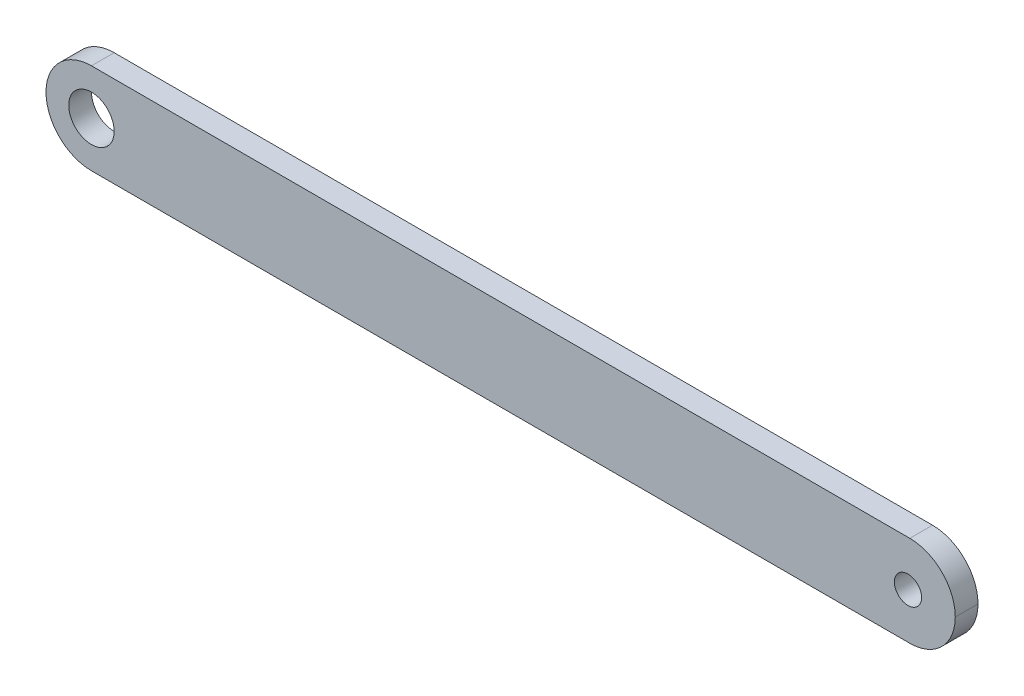
ISO-10303-21;
HEADER;
FILE_DESCRIPTION(('STEP AP214'),'2;1');
FILE_NAME('part.step','',(''),(''),'','','');
FILE_SCHEMA(('AUTOMOTIVE_DESIGN { 1 0 10303 214 1 1 1 1 }'));
ENDSEC;
DATA;
#1=APPLICATION_CONTEXT('core data for automotive mechanical design processes');
#2=APPLICATION_PROTOCOL_DEFINITION('international standard','automotive_design',2000,#1);
#3=PRODUCT_CONTEXT('',#1,'mechanical');
#4=PRODUCT('Part','Part','',(#3));
#5=PRODUCT_RELATED_PRODUCT_CATEGORY('part','',(#4));
#6=PRODUCT_DEFINITION_FORMATION('','',#4);
#7=PRODUCT_DEFINITION_CONTEXT('part definition',#1,'design');
#8=PRODUCT_DEFINITION('design','',#6,#7);
#9=PRODUCT_DEFINITION_SHAPE('','',#8);
#10=(LENGTH_UNIT() NAMED_UNIT(*) SI_UNIT(.MILLI.,.METRE.));
#11=(NAMED_UNIT(*) PLANE_ANGLE_UNIT() SI_UNIT($,.RADIAN.));
#12=(NAMED_UNIT(*) SI_UNIT($,.STERADIAN.) SOLID_ANGLE_UNIT());
#13=UNCERTAINTY_MEASURE_WITH_UNIT(LENGTH_MEASURE(1.E-05),#10,'distance_accuracy_value','');
#14=(GEOMETRIC_REPRESENTATION_CONTEXT(3) GLOBAL_UNCERTAINTY_ASSIGNED_CONTEXT((#13)) GLOBAL_UNIT_ASSIGNED_CONTEXT((#10,
#11,#12)) REPRESENTATION_CONTEXT('',''));
#15=CARTESIAN_POINT('',(0.,0.,0.));
#16=DIRECTION('',(0.,0.,1.));
#17=DIRECTION('',(1.,0.,0.));
#18=AXIS2_PLACEMENT_3D('',#15,#16,#17);
#19=CARTESIAN_POINT('',(0.,0.,3.175));
#20=DIRECTION('',(0.,1.,0.));
#21=DIRECTION('',(0.,0.,1.));
#22=AXIS2_PLACEMENT_3D('',#19,#20,#21);
#23=PLANE('',#22);
#24=DIRECTION('',(1.,0.,0.));
#25=VECTOR('',#24,1.);
#26=CARTESIAN_POINT('',(0.,0.,0.));
#27=LINE('',#26,#25);
#28=CARTESIAN_POINT('',(6.35,0.,0.));
#29=VERTEX_POINT('',#28);
#30=CARTESIAN_POINT('',(120.65,0.,0.));
#31=VERTEX_POINT('',#30);
#32=EDGE_CURVE('E99',#29,#31,#27,.T.);
#33=ORIENTED_EDGE('',*,*,#32,.T.);
#34=DIRECTION('',(0.,0.,-1.));
#35=VECTOR('',#34,1.);
#36=CARTESIAN_POINT('',(120.65,0.,3.175));
#37=LINE('',#36,#35);
#38=CARTESIAN_POINT('',(120.65,0.,3.175));
#39=VERTEX_POINT('',#38);
#40=EDGE_CURVE('E138',#31,#39,#37,.F.);
#41=ORIENTED_EDGE('',*,*,#40,.T.);
#42=DIRECTION('',(1.,0.,0.));
#43=VECTOR('',#42,1.);
#44=CARTESIAN_POINT('',(0.,0.,3.175));
#45=LINE('',#44,#43);
#46=CARTESIAN_POINT('',(6.35,0.,3.175));
#47=VERTEX_POINT('',#46);
#48=EDGE_CURVE('E148',#47,#39,#45,.T.);
#49=ORIENTED_EDGE('',*,*,#48,.F.);
#50=DIRECTION('',(0.,0.,-1.));
#51=VECTOR('',#50,1.);
#52=CARTESIAN_POINT('',(6.35,0.,3.175));
#53=LINE('',#52,#51);
#54=EDGE_CURVE('E129',#47,#29,#53,.T.);
#55=ORIENTED_EDGE('',*,*,#54,.T.);
#56=EDGE_LOOP('',(#33,#41,#49,#55));
#57=FACE_BOUND('',#56,.T.);
#58=ADVANCED_FACE('F39',(#57),#23,.F.);
#59=CARTESIAN_POINT('',(0.,12.7,3.175));
#60=DIRECTION('',(0.,-1.,0.));
#61=DIRECTION('',(0.,0.,-1.));
#62=AXIS2_PLACEMENT_3D('',#59,#60,#61);
#63=PLANE('',#62);
#64=DIRECTION('',(-1.,0.,0.));
#65=VECTOR('',#64,1.);
#66=CARTESIAN_POINT('',(0.,12.7,3.175));
#67=LINE('',#66,#65);
#68=CARTESIAN_POINT('',(120.65,12.7,3.175));
#69=VERTEX_POINT('',#68);
#70=CARTESIAN_POINT('',(6.35,12.7,3.175));
#71=VERTEX_POINT('',#70);
#72=EDGE_CURVE('E103',#69,#71,#67,.T.);
#73=ORIENTED_EDGE('',*,*,#72,.F.);
#74=DIRECTION('',(0.,0.,-1.));
#75=VECTOR('',#74,1.);
#76=CARTESIAN_POINT('',(120.65,12.7,3.175));
#77=LINE('',#76,#75);
#78=CARTESIAN_POINT('',(120.65,12.7,0.));
#79=VERTEX_POINT('',#78);
#80=EDGE_CURVE('E11',#69,#79,#77,.T.);
#81=ORIENTED_EDGE('',*,*,#80,.T.);
#82=DIRECTION('',(-1.,0.,0.));
#83=VECTOR('',#82,1.);
#84=CARTESIAN_POINT('',(0.,12.7,0.));
#85=LINE('',#84,#83);
#86=CARTESIAN_POINT('',(6.35,12.7,0.));
#87=VERTEX_POINT('',#86);
#88=EDGE_CURVE('E153',#79,#87,#85,.T.);
#89=ORIENTED_EDGE('',*,*,#88,.T.);
#90=DIRECTION('',(0.,0.,-1.));
#91=VECTOR('',#90,1.);
#92=CARTESIAN_POINT('',(6.35,12.7,3.175));
#93=LINE('',#92,#91);
#94=EDGE_CURVE('E117',#87,#71,#93,.F.);
#95=ORIENTED_EDGE('',*,*,#94,.T.);
#96=EDGE_LOOP('',(#73,#81,#89,#95));
#97=FACE_BOUND('',#96,.T.);
#98=ADVANCED_FACE('F183',(#97),#63,.F.);
#99=CARTESIAN_POINT('',(0.,0.,3.175));
#100=DIRECTION('',(0.,0.,-1.));
#101=DIRECTION('',(-1.,0.,0.));
#102=AXIS2_PLACEMENT_3D('',#99,#100,#101);
#103=PLANE('',#102);
#104=CARTESIAN_POINT('',(6.35,6.35,3.175));
#105=DIRECTION('',(0.,0.,1.));
#106=DIRECTION('',(1.,0.,0.));
#107=AXIS2_PLACEMENT_3D('',#104,#105,#106);
#108=CIRCLE('',#107,3.175);
#109=CARTESIAN_POINT('',(9.525,6.35,3.175));
#110=VERTEX_POINT('',#109);
#111=EDGE_CURVE('E166',#110,#110,#108,.T.);
#112=ORIENTED_EDGE('',*,*,#111,.F.);
#113=EDGE_LOOP('',(#112));
#114=FACE_BOUND('',#113,.T.);
#115=CARTESIAN_POINT('',(120.396,6.35,3.175));
#116=DIRECTION('',(0.,0.,1.));
#117=DIRECTION('',(1.,0.,0.));
#118=AXIS2_PLACEMENT_3D('',#115,#116,#117);
#119=CIRCLE('',#118,1.90500000000002);
#120=CARTESIAN_POINT('',(122.301,6.35,3.175));
#121=VERTEX_POINT('',#120);
#122=EDGE_CURVE('E159',#121,#121,#119,.T.);
#123=ORIENTED_EDGE('',*,*,#122,.F.);
#124=EDGE_LOOP('',(#123));
#125=FACE_BOUND('',#124,.T.);
#126=ORIENTED_EDGE('',*,*,#48,.T.);
#127=CARTESIAN_POINT('',(120.65,6.35,3.175));
#128=DIRECTION('',(0.,0.,-1.));
#129=DIRECTION('',(-1.,0.,0.));
#130=AXIS2_PLACEMENT_3D('',#127,#128,#129);
#131=CIRCLE('',#130,6.35);
#132=CARTESIAN_POINT('',(127.,6.35,3.175));
#133=VERTEX_POINT('',#132);
#134=EDGE_CURVE('E49',#39,#133,#131,.F.);
#135=ORIENTED_EDGE('',*,*,#134,.T.);
#136=CARTESIAN_POINT('',(120.65,6.35,3.175));
#137=DIRECTION('',(0.,0.,-1.));
#138=DIRECTION('',(-1.,0.,0.));
#139=AXIS2_PLACEMENT_3D('',#136,#137,#138);
#140=CIRCLE('',#139,6.35);
#141=EDGE_CURVE('E59',#133,#69,#140,.F.);
#142=ORIENTED_EDGE('',*,*,#141,.T.);
#143=ORIENTED_EDGE('',*,*,#72,.T.);
#144=CARTESIAN_POINT('',(6.35,6.35,3.175));
#145=DIRECTION('',(0.,0.,-1.));
#146=DIRECTION('',(-1.,0.,0.));
#147=AXIS2_PLACEMENT_3D('',#144,#145,#146);
#148=CIRCLE('',#147,6.35);
#149=CARTESIAN_POINT('',(0.,6.35,3.175));
#150=VERTEX_POINT('',#149);
#151=EDGE_CURVE('E126',#71,#150,#148,.F.);
#152=ORIENTED_EDGE('',*,*,#151,.T.);
#153=CARTESIAN_POINT('',(6.35,6.35,3.175));
#154=DIRECTION('',(0.,0.,-1.));
#155=DIRECTION('',(-1.,0.,0.));
#156=AXIS2_PLACEMENT_3D('',#153,#154,#155);
#157=CIRCLE('',#156,6.35);
#158=EDGE_CURVE('E109',#150,#47,#157,.F.);
#159=ORIENTED_EDGE('',*,*,#158,.T.);
#160=EDGE_LOOP('',(#126,#135,#142,#143,#152,#159));
#161=FACE_BOUND('',#160,.T.);
#162=ADVANCED_FACE('F151',(#114,#125,#161),#103,.F.);
#163=CARTESIAN_POINT('',(0.,0.,0.));
#164=DIRECTION('',(0.,0.,-1.));
#165=DIRECTION('',(-1.,0.,0.));
#166=AXIS2_PLACEMENT_3D('',#163,#164,#165);
#167=PLANE('',#166);
#168=CARTESIAN_POINT('',(6.35,6.35,0.));
#169=DIRECTION('',(0.,0.,1.));
#170=DIRECTION('',(1.,0.,0.));
#171=AXIS2_PLACEMENT_3D('',#168,#169,#170);
#172=CIRCLE('',#171,3.175);
#173=CARTESIAN_POINT('',(9.525,6.35,0.));
#174=VERTEX_POINT('',#173);
#175=EDGE_CURVE('E113',#174,#174,#172,.T.);
#176=ORIENTED_EDGE('',*,*,#175,.T.);
#177=EDGE_LOOP('',(#176));
#178=FACE_BOUND('',#177,.T.);
#179=CARTESIAN_POINT('',(120.396,6.35,0.));
#180=DIRECTION('',(0.,0.,1.));
#181=DIRECTION('',(1.,0.,0.));
#182=AXIS2_PLACEMENT_3D('',#179,#180,#181);
#183=CIRCLE('',#182,1.90500000000002);
#184=CARTESIAN_POINT('',(122.301,6.35,0.));
#185=VERTEX_POINT('',#184);
#186=EDGE_CURVE('E170',#185,#185,#183,.T.);
#187=ORIENTED_EDGE('',*,*,#186,.T.);
#188=EDGE_LOOP('',(#187));
#189=FACE_BOUND('',#188,.T.);
#190=CARTESIAN_POINT('',(120.65,6.35,0.));
#191=DIRECTION('',(0.,0.,-1.));
#192=DIRECTION('',(-1.,0.,0.));
#193=AXIS2_PLACEMENT_3D('',#190,#191,#192);
#194=CIRCLE('',#193,6.35);
#195=CARTESIAN_POINT('',(127.,6.35,0.));
#196=VERTEX_POINT('',#195);
#197=EDGE_CURVE('E131',#79,#196,#194,.T.);
#198=ORIENTED_EDGE('',*,*,#197,.T.);
#199=CARTESIAN_POINT('',(120.65,6.35,0.));
#200=DIRECTION('',(0.,0.,-1.));
#201=DIRECTION('',(-1.,0.,0.));
#202=AXIS2_PLACEMENT_3D('',#199,#200,#201);
#203=CIRCLE('',#202,6.35);
#204=EDGE_CURVE('E135',#196,#31,#203,.T.);
#205=ORIENTED_EDGE('',*,*,#204,.T.);
#206=ORIENTED_EDGE('',*,*,#32,.F.);
#207=CARTESIAN_POINT('',(6.35,6.35,0.));
#208=DIRECTION('',(0.,0.,-1.));
#209=DIRECTION('',(-1.,0.,0.));
#210=AXIS2_PLACEMENT_3D('',#207,#208,#209);
#211=CIRCLE('',#210,6.35);
#212=CARTESIAN_POINT('',(0.,6.35,0.));
#213=VERTEX_POINT('',#212);
#214=EDGE_CURVE('E91',#29,#213,#211,.T.);
#215=ORIENTED_EDGE('',*,*,#214,.T.);
#216=CARTESIAN_POINT('',(6.35,6.35,0.));
#217=DIRECTION('',(0.,0.,-1.));
#218=DIRECTION('',(-1.,0.,0.));
#219=AXIS2_PLACEMENT_3D('',#216,#217,#218);
#220=CIRCLE('',#219,6.35);
#221=EDGE_CURVE('E96',#213,#87,#220,.T.);
#222=ORIENTED_EDGE('',*,*,#221,.T.);
#223=ORIENTED_EDGE('',*,*,#88,.F.);
#224=EDGE_LOOP('',(#198,#205,#206,#215,#222,#223));
#225=FACE_BOUND('',#224,.T.);
#226=ADVANCED_FACE('F93',(#178,#189,#225),#167,.T.);
#227=CARTESIAN_POINT('',(6.35,6.35,3.175));
#228=DIRECTION('',(0.,0.,-1.));
#229=DIRECTION('',(-1.,0.,0.));
#230=AXIS2_PLACEMENT_3D('',#227,#228,#229);
#231=CYLINDRICAL_SURFACE('',#230,6.35);
#232=ORIENTED_EDGE('',*,*,#54,.F.);
#233=ORIENTED_EDGE('',*,*,#158,.F.);
#234=DIRECTION('',(0.,0.,-1.));
#235=VECTOR('',#234,1.);
#236=CARTESIAN_POINT('',(0.,6.35,3.175));
#237=LINE('',#236,#235);
#238=EDGE_CURVE('E107',#213,#150,#237,.F.);
#239=ORIENTED_EDGE('',*,*,#238,.F.);
#240=ORIENTED_EDGE('',*,*,#214,.F.);
#241=EDGE_LOOP('',(#232,#233,#239,#240));
#242=FACE_BOUND('',#241,.T.);
#243=ADVANCED_FACE('F108',(#242),#231,.T.);
#244=CARTESIAN_POINT('',(6.35,6.35,3.175));
#245=DIRECTION('',(0.,0.,-1.));
#246=DIRECTION('',(-1.,0.,0.));
#247=AXIS2_PLACEMENT_3D('',#244,#245,#246);
#248=CYLINDRICAL_SURFACE('',#247,6.35);
#249=ORIENTED_EDGE('',*,*,#151,.F.);
#250=ORIENTED_EDGE('',*,*,#94,.F.);
#251=ORIENTED_EDGE('',*,*,#221,.F.);
#252=ORIENTED_EDGE('',*,*,#238,.T.);
#253=EDGE_LOOP('',(#249,#250,#251,#252));
#254=FACE_BOUND('',#253,.T.);
#255=ADVANCED_FACE('F115',(#254),#248,.T.);
#256=CARTESIAN_POINT('',(120.396,6.35,0.));
#257=DIRECTION('',(0.,0.,1.));
#258=DIRECTION('',(1.,0.,0.));
#259=AXIS2_PLACEMENT_3D('',#256,#257,#258);
#260=CYLINDRICAL_SURFACE('',#259,1.90500000000002);
#261=ORIENTED_EDGE('',*,*,#186,.F.);
#262=EDGE_LOOP('',(#261));
#263=FACE_BOUND('',#262,.T.);
#264=ORIENTED_EDGE('',*,*,#122,.T.);
#265=EDGE_LOOP('',(#264));
#266=FACE_BOUND('',#265,.T.);
#267=ADVANCED_FACE('F197',(#263,#266),#260,.F.);
#268=CARTESIAN_POINT('',(6.35,6.35,0.));
#269=DIRECTION('',(0.,0.,1.));
#270=DIRECTION('',(1.,0.,0.));
#271=AXIS2_PLACEMENT_3D('',#268,#269,#270);
#272=CYLINDRICAL_SURFACE('',#271,3.175);
#273=ORIENTED_EDGE('',*,*,#175,.F.);
#274=EDGE_LOOP('',(#273));
#275=FACE_BOUND('',#274,.T.);
#276=ORIENTED_EDGE('',*,*,#111,.T.);
#277=EDGE_LOOP('',(#276));
#278=FACE_BOUND('',#277,.T.);
#279=ADVANCED_FACE('F203',(#275,#278),#272,.F.);
#280=CARTESIAN_POINT('',(120.65,6.35,3.175));
#281=DIRECTION('',(0.,0.,-1.));
#282=DIRECTION('',(-1.,0.,0.));
#283=AXIS2_PLACEMENT_3D('',#280,#281,#282);
#284=CYLINDRICAL_SURFACE('',#283,6.35);
#285=ORIENTED_EDGE('',*,*,#80,.F.);
#286=ORIENTED_EDGE('',*,*,#141,.F.);
#287=DIRECTION('',(0.,0.,-1.));
#288=VECTOR('',#287,1.);
#289=CARTESIAN_POINT('',(127.,6.35,3.175));
#290=LINE('',#289,#288);
#291=EDGE_CURVE('E43',#196,#133,#290,.F.);
#292=ORIENTED_EDGE('',*,*,#291,.F.);
#293=ORIENTED_EDGE('',*,*,#197,.F.);
#294=EDGE_LOOP('',(#285,#286,#292,#293));
#295=FACE_BOUND('',#294,.T.);
#296=ADVANCED_FACE('F41',(#295),#284,.T.);
#297=CARTESIAN_POINT('',(120.65,6.35,3.175));
#298=DIRECTION('',(0.,0.,-1.));
#299=DIRECTION('',(-1.,0.,0.));
#300=AXIS2_PLACEMENT_3D('',#297,#298,#299);
#301=CYLINDRICAL_SURFACE('',#300,6.35);
#302=ORIENTED_EDGE('',*,*,#134,.F.);
#303=ORIENTED_EDGE('',*,*,#40,.F.);
#304=ORIENTED_EDGE('',*,*,#204,.F.);
#305=ORIENTED_EDGE('',*,*,#291,.T.);
#306=EDGE_LOOP('',(#302,#303,#304,#305));
#307=FACE_BOUND('',#306,.T.);
#308=ADVANCED_FACE('F178',(#307),#301,.T.);
#309=CLOSED_SHELL('',(#58,#98,#162,#226,#243,#255,#267,#279,#296,#308));
#310=MANIFOLD_SOLID_BREP('B2',#309);
#311=ADVANCED_BREP_SHAPE_REPRESENTATION('',(#18,#310),#14);
#312=SHAPE_DEFINITION_REPRESENTATION(#9,#311);
ENDSEC;
END-ISO-10303-21;
